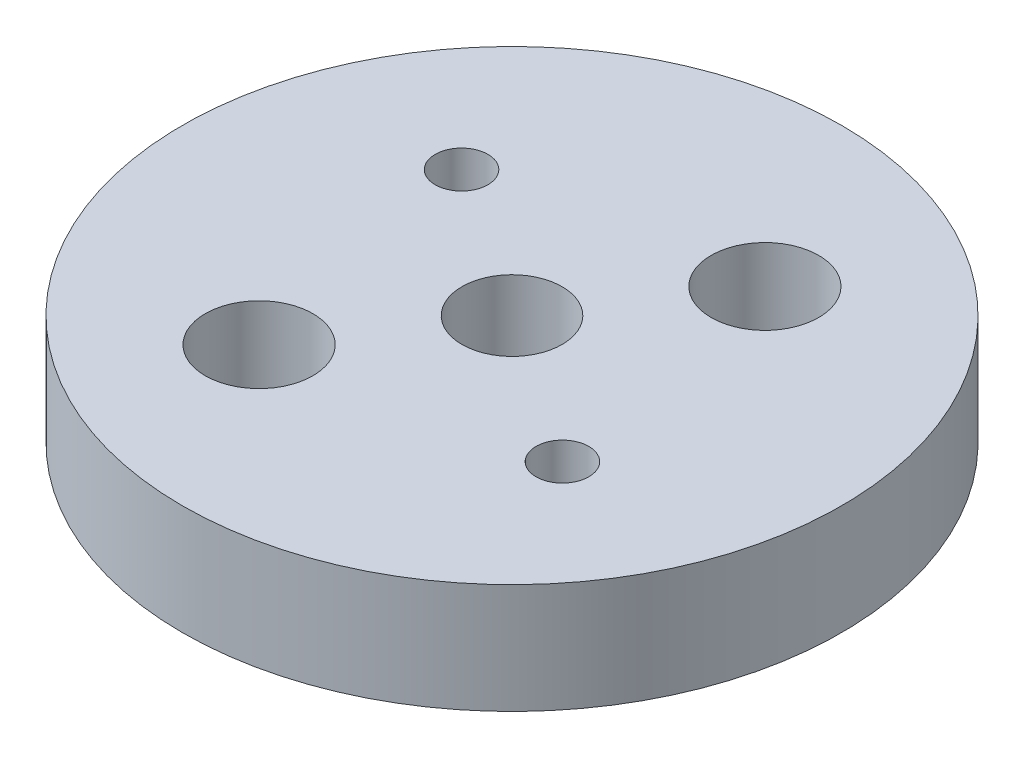
ISO-10303-21;
HEADER;
FILE_DESCRIPTION(('STEP AP214'),'2;1');
FILE_NAME('part.step','',(''),(''),'','','');
FILE_SCHEMA(('AUTOMOTIVE_DESIGN { 1 0 10303 214 1 1 1 1 }'));
ENDSEC;
DATA;
#1=APPLICATION_CONTEXT('core data for automotive mechanical design processes');
#2=APPLICATION_PROTOCOL_DEFINITION('international standard','automotive_design',2000,#1);
#3=PRODUCT_CONTEXT('',#1,'mechanical');
#4=PRODUCT('Part','Part','',(#3));
#5=PRODUCT_RELATED_PRODUCT_CATEGORY('part','',(#4));
#6=PRODUCT_DEFINITION_FORMATION('','',#4);
#7=PRODUCT_DEFINITION_CONTEXT('part definition',#1,'design');
#8=PRODUCT_DEFINITION('design','',#6,#7);
#9=PRODUCT_DEFINITION_SHAPE('','',#8);
#10=(LENGTH_UNIT() NAMED_UNIT(*) SI_UNIT(.MILLI.,.METRE.));
#11=(NAMED_UNIT(*) PLANE_ANGLE_UNIT() SI_UNIT($,.RADIAN.));
#12=(NAMED_UNIT(*) SI_UNIT($,.STERADIAN.) SOLID_ANGLE_UNIT());
#13=UNCERTAINTY_MEASURE_WITH_UNIT(LENGTH_MEASURE(1.E-05),#10,'distance_accuracy_value','');
#14=(GEOMETRIC_REPRESENTATION_CONTEXT(3) GLOBAL_UNCERTAINTY_ASSIGNED_CONTEXT((#13)) GLOBAL_UNIT_ASSIGNED_CONTEXT((#10,
#11,#12)) REPRESENTATION_CONTEXT('',''));
#15=CARTESIAN_POINT('',(0.,0.,0.));
#16=DIRECTION('',(0.,0.,1.));
#17=DIRECTION('',(1.,0.,0.));
#18=AXIS2_PLACEMENT_3D('',#15,#16,#17);
#19=CARTESIAN_POINT('',(0.,6.35,0.));
#20=DIRECTION('',(0.,1.,0.));
#21=DIRECTION('',(0.,0.,1.));
#22=AXIS2_PLACEMENT_3D('',#19,#20,#21);
#23=PLANE('',#22);
#24=CARTESIAN_POINT('',(8.76728666234183,6.35,5.85212487736924));
#25=DIRECTION('',(0.,1.,0.));
#26=DIRECTION('',(0.,0.,1.));
#27=AXIS2_PLACEMENT_3D('',#24,#25,#26);
#28=CIRCLE('',#27,1.524);
#29=CARTESIAN_POINT('',(8.76728666234183,6.35,7.37612487736924));
#30=VERTEX_POINT('',#29);
#31=EDGE_CURVE('E59',#30,#30,#28,.T.);
#32=ORIENTED_EDGE('',*,*,#31,.F.);
#33=EDGE_LOOP('',(#32));
#34=FACE_BOUND('',#33,.T.);
#35=CARTESIAN_POINT('',(5.85212487736921,6.35,-8.76728666234185));
#36=DIRECTION('',(0.,1.,0.));
#37=DIRECTION('',(0.,0.,1.));
#38=AXIS2_PLACEMENT_3D('',#35,#36,#37);
#39=CIRCLE('',#38,3.1115);
#40=CARTESIAN_POINT('',(5.85212487736921,6.35,-5.65578666234185));
#41=VERTEX_POINT('',#40);
#42=EDGE_CURVE('E47',#41,#41,#39,.T.);
#43=ORIENTED_EDGE('',*,*,#42,.F.);
#44=EDGE_LOOP('',(#43));
#45=FACE_BOUND('',#44,.T.);
#46=CARTESIAN_POINT('',(0.,6.35,0.));
#47=DIRECTION('',(0.,1.,0.));
#48=DIRECTION('',(0.,0.,1.));
#49=AXIS2_PLACEMENT_3D('',#46,#47,#48);
#50=CIRCLE('',#49,19.05);
#51=CARTESIAN_POINT('',(0.,6.35,19.05));
#52=VERTEX_POINT('',#51);
#53=EDGE_CURVE('E10',#52,#52,#50,.T.);
#54=ORIENTED_EDGE('',*,*,#53,.T.);
#55=EDGE_LOOP('',(#54));
#56=FACE_BOUND('',#55,.T.);
#57=CARTESIAN_POINT('',(0.,6.35,0.));
#58=DIRECTION('',(0.,1.,0.));
#59=DIRECTION('',(0.,0.,1.));
#60=AXIS2_PLACEMENT_3D('',#57,#58,#59);
#61=CIRCLE('',#60,2.8956);
#62=CARTESIAN_POINT('',(0.,6.35,2.8956));
#63=VERTEX_POINT('',#62);
#64=EDGE_CURVE('E42',#63,#63,#61,.T.);
#65=ORIENTED_EDGE('',*,*,#64,.F.);
#66=EDGE_LOOP('',(#65));
#67=FACE_BOUND('',#66,.T.);
#68=CARTESIAN_POINT('',(-5.85212487736926,6.35,8.76728666234185));
#69=DIRECTION('',(0.,1.,0.));
#70=DIRECTION('',(0.,0.,1.));
#71=AXIS2_PLACEMENT_3D('',#68,#69,#70);
#72=CIRCLE('',#71,3.1115);
#73=CARTESIAN_POINT('',(-5.85212487736926,6.35,11.8787866623419));
#74=VERTEX_POINT('',#73);
#75=EDGE_CURVE('E53',#74,#74,#72,.T.);
#76=ORIENTED_EDGE('',*,*,#75,.F.);
#77=EDGE_LOOP('',(#76));
#78=FACE_BOUND('',#77,.T.);
#79=CARTESIAN_POINT('',(-8.76728666234187,6.35,-5.85212487736923));
#80=DIRECTION('',(0.,1.,0.));
#81=DIRECTION('',(0.,0.,1.));
#82=AXIS2_PLACEMENT_3D('',#79,#80,#81);
#83=CIRCLE('',#82,1.524);
#84=CARTESIAN_POINT('',(-8.76728666234187,6.35,-4.32812487736923));
#85=VERTEX_POINT('',#84);
#86=EDGE_CURVE('E65',#85,#85,#83,.T.);
#87=ORIENTED_EDGE('',*,*,#86,.F.);
#88=EDGE_LOOP('',(#87));
#89=FACE_BOUND('',#88,.T.);
#90=ADVANCED_FACE('F31',(#34,#45,#56,#67,#78,#89),#23,.T.);
#91=CARTESIAN_POINT('',(0.,0.,0.));
#92=DIRECTION('',(0.,1.,0.));
#93=DIRECTION('',(0.,0.,1.));
#94=AXIS2_PLACEMENT_3D('',#91,#92,#93);
#95=PLANE('',#94);
#96=CARTESIAN_POINT('',(8.76728666234183,0.,5.85212487736924));
#97=DIRECTION('',(0.,1.,0.));
#98=DIRECTION('',(0.,0.,1.));
#99=AXIS2_PLACEMENT_3D('',#96,#97,#98);
#100=CIRCLE('',#99,1.524);
#101=CARTESIAN_POINT('',(8.76728666234183,0.,7.37612487736924));
#102=VERTEX_POINT('',#101);
#103=EDGE_CURVE('E62',#102,#102,#100,.T.);
#104=ORIENTED_EDGE('',*,*,#103,.T.);
#105=EDGE_LOOP('',(#104));
#106=FACE_BOUND('',#105,.T.);
#107=CARTESIAN_POINT('',(5.85212487736921,0.,-8.76728666234185));
#108=DIRECTION('',(0.,1.,0.));
#109=DIRECTION('',(0.,0.,1.));
#110=AXIS2_PLACEMENT_3D('',#107,#108,#109);
#111=CIRCLE('',#110,3.1115);
#112=CARTESIAN_POINT('',(5.85212487736921,0.,-5.65578666234185));
#113=VERTEX_POINT('',#112);
#114=EDGE_CURVE('E50',#113,#113,#111,.T.);
#115=ORIENTED_EDGE('',*,*,#114,.T.);
#116=EDGE_LOOP('',(#115));
#117=FACE_BOUND('',#116,.T.);
#118=CARTESIAN_POINT('',(0.,0.,0.));
#119=DIRECTION('',(0.,1.,0.));
#120=DIRECTION('',(0.,0.,1.));
#121=AXIS2_PLACEMENT_3D('',#118,#119,#120);
#122=CIRCLE('',#121,19.05);
#123=CARTESIAN_POINT('',(0.,0.,19.05));
#124=VERTEX_POINT('',#123);
#125=EDGE_CURVE('E35',#124,#124,#122,.T.);
#126=ORIENTED_EDGE('',*,*,#125,.F.);
#127=EDGE_LOOP('',(#126));
#128=FACE_BOUND('',#127,.T.);
#129=CARTESIAN_POINT('',(0.,0.,0.));
#130=DIRECTION('',(0.,1.,0.));
#131=DIRECTION('',(0.,0.,1.));
#132=AXIS2_PLACEMENT_3D('',#129,#130,#131);
#133=CIRCLE('',#132,2.8956);
#134=CARTESIAN_POINT('',(0.,0.,2.8956));
#135=VERTEX_POINT('',#134);
#136=EDGE_CURVE('E44',#135,#135,#133,.T.);
#137=ORIENTED_EDGE('',*,*,#136,.T.);
#138=EDGE_LOOP('',(#137));
#139=FACE_BOUND('',#138,.T.);
#140=CARTESIAN_POINT('',(-5.85212487736926,0.,8.76728666234185));
#141=DIRECTION('',(0.,1.,0.));
#142=DIRECTION('',(0.,0.,1.));
#143=AXIS2_PLACEMENT_3D('',#140,#141,#142);
#144=CIRCLE('',#143,3.1115);
#145=CARTESIAN_POINT('',(-5.85212487736926,0.,11.8787866623419));
#146=VERTEX_POINT('',#145);
#147=EDGE_CURVE('E56',#146,#146,#144,.T.);
#148=ORIENTED_EDGE('',*,*,#147,.T.);
#149=EDGE_LOOP('',(#148));
#150=FACE_BOUND('',#149,.T.);
#151=CARTESIAN_POINT('',(-8.76728666234187,0.,-5.85212487736923));
#152=DIRECTION('',(0.,1.,0.));
#153=DIRECTION('',(0.,0.,1.));
#154=AXIS2_PLACEMENT_3D('',#151,#152,#153);
#155=CIRCLE('',#154,1.524);
#156=CARTESIAN_POINT('',(-8.76728666234187,0.,-4.32812487736923));
#157=VERTEX_POINT('',#156);
#158=EDGE_CURVE('E68',#157,#157,#155,.T.);
#159=ORIENTED_EDGE('',*,*,#158,.T.);
#160=EDGE_LOOP('',(#159));
#161=FACE_BOUND('',#160,.T.);
#162=ADVANCED_FACE('F78',(#106,#117,#128,#139,#150,#161),#95,.F.);
#163=CARTESIAN_POINT('',(0.,6.35,0.));
#164=DIRECTION('',(0.,-1.,0.));
#165=DIRECTION('',(0.,0.,-1.));
#166=AXIS2_PLACEMENT_3D('',#163,#164,#165);
#167=CYLINDRICAL_SURFACE('',#166,19.05);
#168=ORIENTED_EDGE('',*,*,#53,.F.);
#169=EDGE_LOOP('',(#168));
#170=FACE_BOUND('',#169,.T.);
#171=ORIENTED_EDGE('',*,*,#125,.T.);
#172=EDGE_LOOP('',(#171));
#173=FACE_BOUND('',#172,.T.);
#174=ADVANCED_FACE('F33',(#170,#173),#167,.T.);
#175=CARTESIAN_POINT('',(0.,6.35,0.));
#176=DIRECTION('',(0.,-1.,0.));
#177=DIRECTION('',(0.,0.,-1.));
#178=AXIS2_PLACEMENT_3D('',#175,#176,#177);
#179=CYLINDRICAL_SURFACE('',#178,2.8956);
#180=ORIENTED_EDGE('',*,*,#64,.T.);
#181=EDGE_LOOP('',(#180));
#182=FACE_BOUND('',#181,.T.);
#183=ORIENTED_EDGE('',*,*,#136,.F.);
#184=EDGE_LOOP('',(#183));
#185=FACE_BOUND('',#184,.T.);
#186=ADVANCED_FACE('F88',(#182,#185),#179,.F.);
#187=CARTESIAN_POINT('',(5.85212487736921,6.35,-8.76728666234185));
#188=DIRECTION('',(0.,-1.,0.));
#189=DIRECTION('',(0.,0.,-1.));
#190=AXIS2_PLACEMENT_3D('',#187,#188,#189);
#191=CYLINDRICAL_SURFACE('',#190,3.1115);
#192=ORIENTED_EDGE('',*,*,#42,.T.);
#193=EDGE_LOOP('',(#192));
#194=FACE_BOUND('',#193,.T.);
#195=ORIENTED_EDGE('',*,*,#114,.F.);
#196=EDGE_LOOP('',(#195));
#197=FACE_BOUND('',#196,.T.);
#198=ADVANCED_FACE('F91',(#194,#197),#191,.F.);
#199=CARTESIAN_POINT('',(-5.85212487736926,6.35,8.76728666234185));
#200=DIRECTION('',(0.,-1.,0.));
#201=DIRECTION('',(0.,0.,-1.));
#202=AXIS2_PLACEMENT_3D('',#199,#200,#201);
#203=CYLINDRICAL_SURFACE('',#202,3.1115);
#204=ORIENTED_EDGE('',*,*,#75,.T.);
#205=EDGE_LOOP('',(#204));
#206=FACE_BOUND('',#205,.T.);
#207=ORIENTED_EDGE('',*,*,#147,.F.);
#208=EDGE_LOOP('',(#207));
#209=FACE_BOUND('',#208,.T.);
#210=ADVANCED_FACE('F95',(#206,#209),#203,.F.);
#211=CARTESIAN_POINT('',(8.76728666234183,6.35,5.85212487736924));
#212=DIRECTION('',(0.,-1.,0.));
#213=DIRECTION('',(0.,0.,-1.));
#214=AXIS2_PLACEMENT_3D('',#211,#212,#213);
#215=CYLINDRICAL_SURFACE('',#214,1.524);
#216=ORIENTED_EDGE('',*,*,#31,.T.);
#217=EDGE_LOOP('',(#216));
#218=FACE_BOUND('',#217,.T.);
#219=ORIENTED_EDGE('',*,*,#103,.F.);
#220=EDGE_LOOP('',(#219));
#221=FACE_BOUND('',#220,.T.);
#222=ADVANCED_FACE('F99',(#218,#221),#215,.F.);
#223=CARTESIAN_POINT('',(-8.76728666234187,6.35,-5.85212487736923));
#224=DIRECTION('',(0.,-1.,0.));
#225=DIRECTION('',(0.,0.,-1.));
#226=AXIS2_PLACEMENT_3D('',#223,#224,#225);
#227=CYLINDRICAL_SURFACE('',#226,1.524);
#228=ORIENTED_EDGE('',*,*,#86,.T.);
#229=EDGE_LOOP('',(#228));
#230=FACE_BOUND('',#229,.T.);
#231=ORIENTED_EDGE('',*,*,#158,.F.);
#232=EDGE_LOOP('',(#231));
#233=FACE_BOUND('',#232,.T.);
#234=ADVANCED_FACE('F74',(#230,#233),#227,.F.);
#235=CLOSED_SHELL('',(#90,#162,#174,#186,#198,#210,#222,#234));
#236=MANIFOLD_SOLID_BREP('B2',#235);
#237=ADVANCED_BREP_SHAPE_REPRESENTATION('',(#18,#236),#14);
#238=SHAPE_DEFINITION_REPRESENTATION(#9,#237);
ENDSEC;
END-ISO-10303-21;
